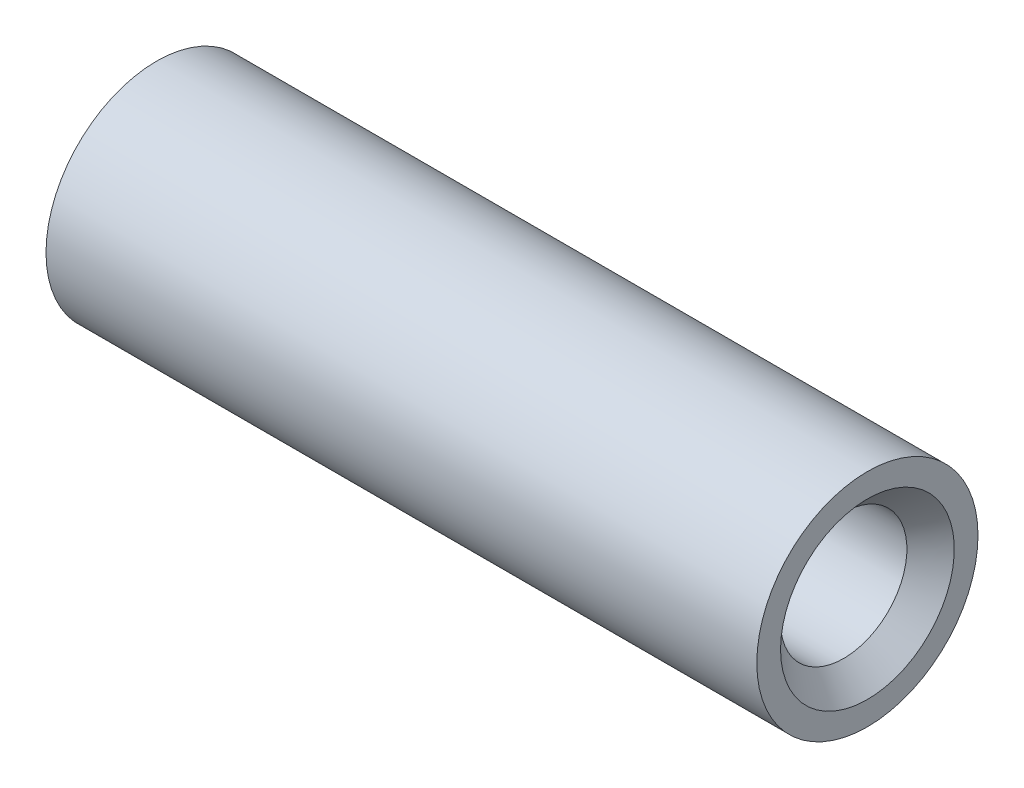
ISO-10303-21;
HEADER;
FILE_DESCRIPTION(('STEP AP214'),'2;1');
FILE_NAME('part.step','',(''),(''),'','','');
FILE_SCHEMA(('AUTOMOTIVE_DESIGN { 1 0 10303 214 1 1 1 1 }'));
ENDSEC;
DATA;
#1=APPLICATION_CONTEXT('core data for automotive mechanical design processes');
#2=APPLICATION_PROTOCOL_DEFINITION('international standard','automotive_design',2000,#1);
#3=PRODUCT_CONTEXT('',#1,'mechanical');
#4=PRODUCT('Part','Part','',(#3));
#5=PRODUCT_RELATED_PRODUCT_CATEGORY('part','',(#4));
#6=PRODUCT_DEFINITION_FORMATION('','',#4);
#7=PRODUCT_DEFINITION_CONTEXT('part definition',#1,'design');
#8=PRODUCT_DEFINITION('design','',#6,#7);
#9=PRODUCT_DEFINITION_SHAPE('','',#8);
#10=(LENGTH_UNIT() NAMED_UNIT(*) SI_UNIT(.MILLI.,.METRE.));
#11=(NAMED_UNIT(*) PLANE_ANGLE_UNIT() SI_UNIT($,.RADIAN.));
#12=(NAMED_UNIT(*) SI_UNIT($,.STERADIAN.) SOLID_ANGLE_UNIT());
#13=UNCERTAINTY_MEASURE_WITH_UNIT(LENGTH_MEASURE(1.E-05),#10,'distance_accuracy_value','');
#14=(GEOMETRIC_REPRESENTATION_CONTEXT(3) GLOBAL_UNCERTAINTY_ASSIGNED_CONTEXT((#13)) GLOBAL_UNIT_ASSIGNED_CONTEXT((#10,
#11,#12)) REPRESENTATION_CONTEXT('',''));
#15=CARTESIAN_POINT('',(0.,0.,0.));
#16=DIRECTION('',(0.,0.,1.));
#17=DIRECTION('',(1.,0.,0.));
#18=AXIS2_PLACEMENT_3D('',#15,#16,#17);
#19=CARTESIAN_POINT('',(-2.5,0.,0.));
#20=DIRECTION('',(1.,0.,0.));
#21=DIRECTION('',(0.,0.,-1.));
#22=AXIS2_PLACEMENT_3D('',#19,#20,#21);
#23=PLANE('',#22);
#24=CARTESIAN_POINT('',(-2.5,0.,0.));
#25=DIRECTION('',(-1.,0.,0.));
#26=DIRECTION('',(0.,0.,1.));
#27=AXIS2_PLACEMENT_3D('',#24,#25,#26);
#28=CIRCLE('',#27,4.);
#29=CARTESIAN_POINT('',(-2.5,0.,4.));
#30=VERTEX_POINT('',#29);
#31=EDGE_CURVE('E56',#30,#30,#28,.T.);
#32=ORIENTED_EDGE('',*,*,#31,.T.);
#33=EDGE_LOOP('',(#32));
#34=FACE_BOUND('',#33,.T.);
#35=ADVANCED_FACE('F35',(#34),#23,.F.);
#36=CARTESIAN_POINT('',(0.,0.,0.));
#37=DIRECTION('',(-1.,0.,0.));
#38=DIRECTION('',(0.,0.,1.));
#39=AXIS2_PLACEMENT_3D('',#36,#37,#38);
#40=CYLINDRICAL_SURFACE('',#39,4.);
#41=CARTESIAN_POINT('',(-21.,0.,0.));
#42=DIRECTION('',(1.,0.,0.));
#43=DIRECTION('',(0.,0.,-1.));
#44=AXIS2_PLACEMENT_3D('',#41,#42,#43);
#45=CIRCLE('',#44,4.);
#46=CARTESIAN_POINT('',(-21.,0.,-4.));
#47=VERTEX_POINT('',#46);
#48=EDGE_CURVE('E51',#47,#47,#45,.F.);
#49=ORIENTED_EDGE('',*,*,#48,.T.);
#50=EDGE_LOOP('',(#49));
#51=FACE_BOUND('',#50,.T.);
#52=ORIENTED_EDGE('',*,*,#31,.F.);
#53=EDGE_LOOP('',(#52));
#54=FACE_BOUND('',#53,.T.);
#55=ADVANCED_FACE('F83',(#51,#54),#40,.F.);
#56=CARTESIAN_POINT('',(-22.5,4.,0.));
#57=DIRECTION('',(1.,0.,0.));
#58=DIRECTION('',(0.,0.,-1.));
#59=AXIS2_PLACEMENT_3D('',#56,#57,#58);
#60=PLANE('',#59);
#61=CARTESIAN_POINT('',(-22.5,0.,0.));
#62=DIRECTION('',(1.,0.,0.));
#63=DIRECTION('',(0.,0.,-1.));
#64=AXIS2_PLACEMENT_3D('',#61,#62,#63);
#65=CIRCLE('',#64,5.50000000000003);
#66=CARTESIAN_POINT('',(-22.5,0.,-5.50000000000003));
#67=VERTEX_POINT('',#66);
#68=EDGE_CURVE('E47',#67,#67,#65,.T.);
#69=ORIENTED_EDGE('',*,*,#68,.T.);
#70=EDGE_LOOP('',(#69));
#71=FACE_BOUND('',#70,.T.);
#72=CARTESIAN_POINT('',(-22.5,0.,0.));
#73=DIRECTION('',(-1.,0.,0.));
#74=DIRECTION('',(0.,0.,1.));
#75=AXIS2_PLACEMENT_3D('',#72,#73,#74);
#76=CIRCLE('',#75,7.00143885045679);
#77=CARTESIAN_POINT('',(-22.5,0.,7.00143885045679));
#78=VERTEX_POINT('',#77);
#79=EDGE_CURVE('E59',#78,#78,#76,.T.);
#80=ORIENTED_EDGE('',*,*,#79,.T.);
#81=EDGE_LOOP('',(#80));
#82=FACE_BOUND('',#81,.T.);
#83=ADVANCED_FACE('F89',(#71,#82),#60,.F.);
#84=CARTESIAN_POINT('',(0.,0.,0.));
#85=DIRECTION('',(-1.,0.,0.));
#86=DIRECTION('',(0.,0.,1.));
#87=AXIS2_PLACEMENT_3D('',#84,#85,#86);
#88=CYLINDRICAL_SURFACE('',#87,7.00143885045679);
#89=ORIENTED_EDGE('',*,*,#79,.F.);
#90=EDGE_LOOP('',(#89));
#91=FACE_BOUND('',#90,.T.);
#92=CARTESIAN_POINT('',(22.5,0.,0.));
#93=DIRECTION('',(-1.,0.,0.));
#94=DIRECTION('',(0.,0.,1.));
#95=AXIS2_PLACEMENT_3D('',#92,#93,#94);
#96=CIRCLE('',#95,7.00143885045679);
#97=CARTESIAN_POINT('',(22.5,0.,7.00143885045679));
#98=VERTEX_POINT('',#97);
#99=EDGE_CURVE('E62',#98,#98,#96,.T.);
#100=ORIENTED_EDGE('',*,*,#99,.T.);
#101=EDGE_LOOP('',(#100));
#102=FACE_BOUND('',#101,.T.);
#103=ADVANCED_FACE('F100',(#91,#102),#88,.T.);
#104=CARTESIAN_POINT('',(22.5,7.00143885045679,0.));
#105=DIRECTION('',(-1.,0.,0.));
#106=DIRECTION('',(0.,0.,1.));
#107=AXIS2_PLACEMENT_3D('',#104,#105,#106);
#108=PLANE('',#107);
#109=CARTESIAN_POINT('',(22.5,0.,0.));
#110=DIRECTION('',(-1.,0.,0.));
#111=DIRECTION('',(0.,0.,1.));
#112=AXIS2_PLACEMENT_3D('',#109,#110,#111);
#113=CIRCLE('',#112,5.50000000000001);
#114=CARTESIAN_POINT('',(22.5,0.,5.50000000000001));
#115=VERTEX_POINT('',#114);
#116=EDGE_CURVE('E43',#115,#115,#113,.T.);
#117=ORIENTED_EDGE('',*,*,#116,.T.);
#118=EDGE_LOOP('',(#117));
#119=FACE_BOUND('',#118,.T.);
#120=ORIENTED_EDGE('',*,*,#99,.F.);
#121=EDGE_LOOP('',(#120));
#122=FACE_BOUND('',#121,.T.);
#123=ADVANCED_FACE('F80',(#119,#122),#108,.F.);
#124=CARTESIAN_POINT('',(0.,0.,0.));
#125=DIRECTION('',(-1.,0.,0.));
#126=DIRECTION('',(0.,0.,1.));
#127=AXIS2_PLACEMENT_3D('',#124,#125,#126);
#128=CYLINDRICAL_SURFACE('',#127,4.);
#129=CARTESIAN_POINT('',(21.,0.,0.));
#130=DIRECTION('',(-1.,0.,0.));
#131=DIRECTION('',(0.,0.,1.));
#132=AXIS2_PLACEMENT_3D('',#129,#130,#131);
#133=CIRCLE('',#132,4.);
#134=CARTESIAN_POINT('',(21.,0.,4.));
#135=VERTEX_POINT('',#134);
#136=EDGE_CURVE('E10',#135,#135,#133,.F.);
#137=ORIENTED_EDGE('',*,*,#136,.T.);
#138=EDGE_LOOP('',(#137));
#139=FACE_BOUND('',#138,.T.);
#140=CARTESIAN_POINT('',(2.5,0.,0.));
#141=DIRECTION('',(-1.,0.,0.));
#142=DIRECTION('',(0.,0.,1.));
#143=AXIS2_PLACEMENT_3D('',#140,#141,#142);
#144=CIRCLE('',#143,4.);
#145=CARTESIAN_POINT('',(2.5,0.,4.));
#146=VERTEX_POINT('',#145);
#147=EDGE_CURVE('E65',#146,#146,#144,.T.);
#148=ORIENTED_EDGE('',*,*,#147,.T.);
#149=EDGE_LOOP('',(#148));
#150=FACE_BOUND('',#149,.T.);
#151=ADVANCED_FACE('F69',(#139,#150),#128,.F.);
#152=CARTESIAN_POINT('',(2.5,4.,0.));
#153=DIRECTION('',(-1.,0.,0.));
#154=DIRECTION('',(0.,0.,1.));
#155=AXIS2_PLACEMENT_3D('',#152,#153,#154);
#156=PLANE('',#155);
#157=ORIENTED_EDGE('',*,*,#147,.F.);
#158=EDGE_LOOP('',(#157));
#159=FACE_BOUND('',#158,.T.);
#160=ADVANCED_FACE('F71',(#159),#156,.F.);
#161=CARTESIAN_POINT('',(-21.,0.,0.));
#162=DIRECTION('',(-1.,0.,0.));
#163=DIRECTION('',(0.,0.,1.));
#164=AXIS2_PLACEMENT_3D('',#161,#162,#163);
#165=CONICAL_SURFACE('',#164,4.,0.785398163397452);
#166=ORIENTED_EDGE('',*,*,#68,.F.);
#167=EDGE_LOOP('',(#166));
#168=FACE_BOUND('',#167,.T.);
#169=ORIENTED_EDGE('',*,*,#48,.F.);
#170=EDGE_LOOP('',(#169));
#171=FACE_BOUND('',#170,.T.);
#172=ADVANCED_FACE('F73',(#168,#171),#165,.F.);
#173=CARTESIAN_POINT('',(22.5,0.,0.));
#174=DIRECTION('',(1.,0.,0.));
#175=DIRECTION('',(0.,0.,-1.));
#176=AXIS2_PLACEMENT_3D('',#173,#174,#175);
#177=CONICAL_SURFACE('',#176,5.50000000000001,0.785398163397447);
#178=ORIENTED_EDGE('',*,*,#136,.F.);
#179=EDGE_LOOP('',(#178));
#180=FACE_BOUND('',#179,.T.);
#181=ORIENTED_EDGE('',*,*,#116,.F.);
#182=EDGE_LOOP('',(#181));
#183=FACE_BOUND('',#182,.T.);
#184=ADVANCED_FACE('F38',(#180,#183),#177,.F.);
#185=CLOSED_SHELL('',(#35,#55,#83,#103,#123,#151,#160,#172,#184));
#186=MANIFOLD_SOLID_BREP('B2',#185);
#187=ADVANCED_BREP_SHAPE_REPRESENTATION('',(#18,#186),#14);
#188=SHAPE_DEFINITION_REPRESENTATION(#9,#187);
ENDSEC;
END-ISO-10303-21;
